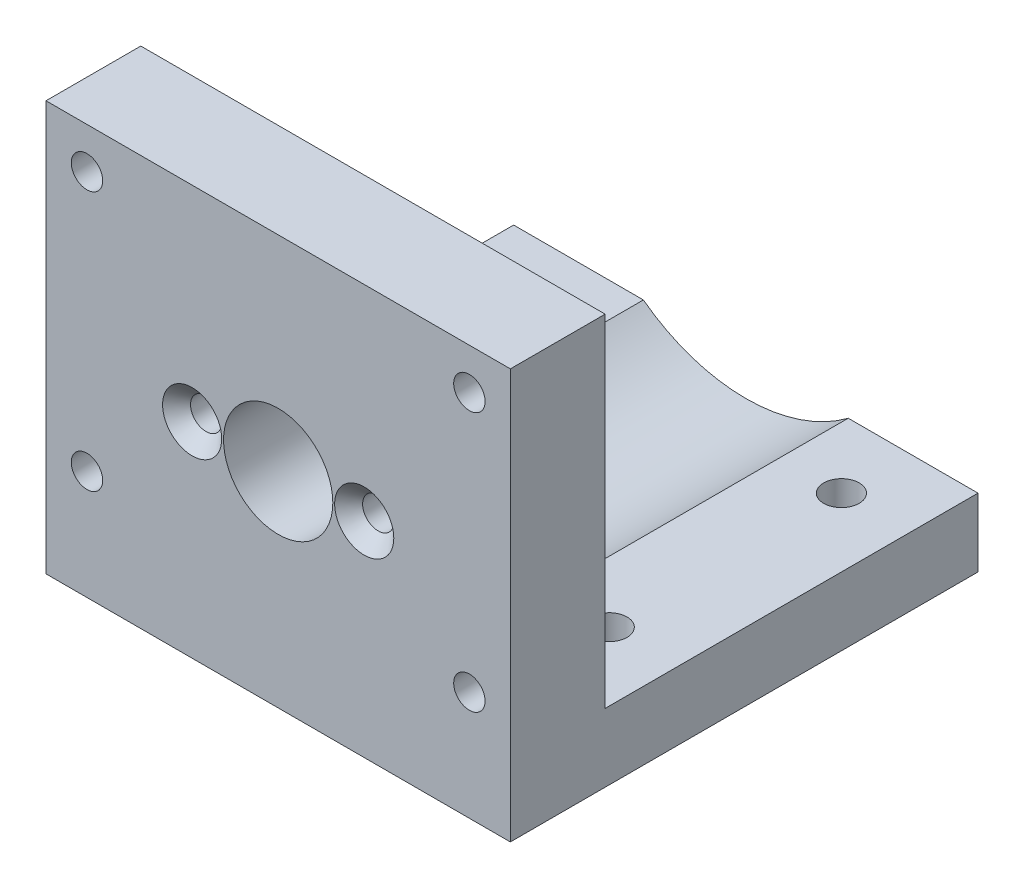
ISO-10303-21;
HEADER;
FILE_DESCRIPTION(('STEP AP214'),'2;1');
FILE_NAME('part.step','',(''),(''),'','','');
FILE_SCHEMA(('AUTOMOTIVE_DESIGN { 1 0 10303 214 1 1 1 1 }'));
ENDSEC;
DATA;
#1=APPLICATION_CONTEXT('core data for automotive mechanical design processes');
#2=APPLICATION_PROTOCOL_DEFINITION('international standard','automotive_design',2000,#1);
#3=PRODUCT_CONTEXT('',#1,'mechanical');
#4=PRODUCT('Part','Part','',(#3));
#5=PRODUCT_RELATED_PRODUCT_CATEGORY('part','',(#4));
#6=PRODUCT_DEFINITION_FORMATION('','',#4);
#7=PRODUCT_DEFINITION_CONTEXT('part definition',#1,'design');
#8=PRODUCT_DEFINITION('design','',#6,#7);
#9=PRODUCT_DEFINITION_SHAPE('','',#8);
#10=(LENGTH_UNIT() NAMED_UNIT(*) SI_UNIT(.MILLI.,.METRE.));
#11=(NAMED_UNIT(*) PLANE_ANGLE_UNIT() SI_UNIT($,.RADIAN.));
#12=(NAMED_UNIT(*) SI_UNIT($,.STERADIAN.) SOLID_ANGLE_UNIT());
#13=UNCERTAINTY_MEASURE_WITH_UNIT(LENGTH_MEASURE(1.E-05),#10,'distance_accuracy_value','');
#14=(GEOMETRIC_REPRESENTATION_CONTEXT(3) GLOBAL_UNCERTAINTY_ASSIGNED_CONTEXT((#13)) GLOBAL_UNIT_ASSIGNED_CONTEXT((#10,
#11,#12)) REPRESENTATION_CONTEXT('',''));
#15=CARTESIAN_POINT('',(0.,0.,0.));
#16=DIRECTION('',(0.,0.,1.));
#17=DIRECTION('',(1.,0.,0.));
#18=AXIS2_PLACEMENT_3D('',#15,#16,#17);
#19=CARTESIAN_POINT('',(0.,6.35,0.));
#20=DIRECTION('',(0.,-1.,0.));
#21=DIRECTION('',(0.,0.,-1.));
#22=AXIS2_PLACEMENT_3D('',#19,#20,#21);
#23=PLANE('',#22);
#24=CARTESIAN_POINT('',(36.83,6.35,-37.1348));
#25=DIRECTION('',(0.,1.,0.));
#26=DIRECTION('',(0.,0.,1.));
#27=AXIS2_PLACEMENT_3D('',#24,#25,#26);
#28=CIRCLE('',#27,1.651);
#29=CARTESIAN_POINT('',(36.83,6.35,-35.4838));
#30=VERTEX_POINT('',#29);
#31=EDGE_CURVE('E177',#30,#30,#28,.T.);
#32=ORIENTED_EDGE('',*,*,#31,.F.);
#33=EDGE_LOOP('',(#32));
#34=FACE_BOUND('',#33,.T.);
#35=CARTESIAN_POINT('',(36.83,6.35,-15.5448));
#36=DIRECTION('',(0.,1.,0.));
#37=DIRECTION('',(0.,0.,1.));
#38=AXIS2_PLACEMENT_3D('',#35,#36,#37);
#39=CIRCLE('',#38,1.651);
#40=CARTESIAN_POINT('',(36.83,6.35,-13.8938));
#41=VERTEX_POINT('',#40);
#42=EDGE_CURVE('E171',#41,#41,#39,.T.);
#43=ORIENTED_EDGE('',*,*,#42,.F.);
#44=EDGE_LOOP('',(#43));
#45=FACE_BOUND('',#44,.T.);
#46=DIRECTION('',(0.,0.,1.));
#47=VECTOR('',#46,1.);
#48=CARTESIAN_POINT('',(31.115,6.35,-43.484825));
#49=LINE('',#48,#47);
#50=CARTESIAN_POINT('',(31.115,6.35,-8.8138));
#51=VERTEX_POINT('',#50);
#52=CARTESIAN_POINT('',(31.115,6.35,-43.4848));
#53=VERTEX_POINT('',#52);
#54=EDGE_CURVE('E68',#51,#53,#49,.F.);
#55=ORIENTED_EDGE('',*,*,#54,.F.);
#56=DIRECTION('',(-1.,0.,0.));
#57=VECTOR('',#56,1.);
#58=CARTESIAN_POINT('',(0.,6.35,-8.8138));
#59=LINE('',#58,#57);
#60=CARTESIAN_POINT('',(43.18,6.35,-8.8138));
#61=VERTEX_POINT('',#60);
#62=EDGE_CURVE('E75',#61,#51,#59,.T.);
#63=ORIENTED_EDGE('',*,*,#62,.F.);
#64=DIRECTION('',(0.,0.,-1.));
#65=VECTOR('',#64,1.);
#66=CARTESIAN_POINT('',(43.18,6.35,0.));
#67=LINE('',#66,#65);
#68=CARTESIAN_POINT('',(43.18,6.35,-43.4848));
#69=VERTEX_POINT('',#68);
#70=EDGE_CURVE('E197',#61,#69,#67,.T.);
#71=ORIENTED_EDGE('',*,*,#70,.T.);
#72=DIRECTION('',(-1.,0.,0.));
#73=VECTOR('',#72,1.);
#74=CARTESIAN_POINT('',(0.,6.35,-43.4848));
#75=LINE('',#74,#73);
#76=EDGE_CURVE('E126',#69,#53,#75,.T.);
#77=ORIENTED_EDGE('',*,*,#76,.T.);
#78=EDGE_LOOP('',(#55,#63,#71,#77));
#79=FACE_BOUND('',#78,.T.);
#80=ADVANCED_FACE('F50',(#34,#45,#79),#23,.F.);
#81=CARTESIAN_POINT('',(6.35,6.35,-37.1348));
#82=DIRECTION('',(0.,1.,0.));
#83=DIRECTION('',(0.,0.,1.));
#84=AXIS2_PLACEMENT_3D('',#81,#82,#83);
#85=CIRCLE('',#84,1.651);
#86=CARTESIAN_POINT('',(6.35,6.35,-35.4838));
#87=VERTEX_POINT('',#86);
#88=EDGE_CURVE('E183',#87,#87,#85,.T.);
#89=ORIENTED_EDGE('',*,*,#88,.F.);
#90=EDGE_LOOP('',(#89));
#91=FACE_BOUND('',#90,.T.);
#92=CARTESIAN_POINT('',(6.35,6.35,-15.5448));
#93=DIRECTION('',(0.,1.,0.));
#94=DIRECTION('',(0.,0.,1.));
#95=AXIS2_PLACEMENT_3D('',#92,#93,#94);
#96=CIRCLE('',#95,1.651);
#97=CARTESIAN_POINT('',(6.35,6.35,-13.8938));
#98=VERTEX_POINT('',#97);
#99=EDGE_CURVE('E165',#98,#98,#96,.T.);
#100=ORIENTED_EDGE('',*,*,#99,.F.);
#101=EDGE_LOOP('',(#100));
#102=FACE_BOUND('',#101,.T.);
#103=DIRECTION('',(0.,0.,1.));
#104=VECTOR('',#103,1.);
#105=CARTESIAN_POINT('',(12.065,6.35,-43.484825));
#106=LINE('',#105,#104);
#107=CARTESIAN_POINT('',(12.065,6.35,-43.4848));
#108=VERTEX_POINT('',#107);
#109=CARTESIAN_POINT('',(12.065,6.35,-8.8138));
#110=VERTEX_POINT('',#109);
#111=EDGE_CURVE('E119',#108,#110,#106,.T.);
#112=ORIENTED_EDGE('',*,*,#111,.F.);
#113=CARTESIAN_POINT('',(0.,6.35,-43.4848));
#114=VERTEX_POINT('',#113);
#115=EDGE_CURVE('E200',#108,#114,#75,.T.);
#116=ORIENTED_EDGE('',*,*,#115,.T.);
#117=DIRECTION('',(0.,0.,1.));
#118=VECTOR('',#117,1.);
#119=CARTESIAN_POINT('',(0.,6.35,0.));
#120=LINE('',#119,#118);
#121=CARTESIAN_POINT('',(0.,6.35,-8.8138));
#122=VERTEX_POINT('',#121);
#123=EDGE_CURVE('E194',#114,#122,#120,.T.);
#124=ORIENTED_EDGE('',*,*,#123,.T.);
#125=EDGE_CURVE('E54',#110,#122,#59,.T.);
#126=ORIENTED_EDGE('',*,*,#125,.F.);
#127=EDGE_LOOP('',(#112,#116,#124,#126));
#128=FACE_BOUND('',#127,.T.);
#129=ADVANCED_FACE('F257',(#91,#102,#128),#23,.F.);
#130=CARTESIAN_POINT('',(0.,0.,0.));
#131=DIRECTION('',(0.,-1.,0.));
#132=DIRECTION('',(0.,0.,-1.));
#133=AXIS2_PLACEMENT_3D('',#130,#131,#132);
#134=PLANE('',#133);
#135=CARTESIAN_POINT('',(36.83,0.,-15.5448));
#136=DIRECTION('',(0.,1.,0.));
#137=DIRECTION('',(0.,0.,1.));
#138=AXIS2_PLACEMENT_3D('',#135,#136,#137);
#139=CIRCLE('',#138,1.651);
#140=CARTESIAN_POINT('',(36.83,0.,-13.8938));
#141=VERTEX_POINT('',#140);
#142=EDGE_CURVE('E168',#141,#141,#139,.T.);
#143=ORIENTED_EDGE('',*,*,#142,.T.);
#144=EDGE_LOOP('',(#143));
#145=FACE_BOUND('',#144,.T.);
#146=CARTESIAN_POINT('',(6.35,0.,-37.1348));
#147=DIRECTION('',(0.,1.,0.));
#148=DIRECTION('',(0.,0.,1.));
#149=AXIS2_PLACEMENT_3D('',#146,#147,#148);
#150=CIRCLE('',#149,1.651);
#151=CARTESIAN_POINT('',(6.35,0.,-35.4838));
#152=VERTEX_POINT('',#151);
#153=EDGE_CURVE('E180',#152,#152,#150,.T.);
#154=ORIENTED_EDGE('',*,*,#153,.T.);
#155=EDGE_LOOP('',(#154));
#156=FACE_BOUND('',#155,.T.);
#157=DIRECTION('',(0.,0.,1.));
#158=VECTOR('',#157,1.);
#159=CARTESIAN_POINT('',(0.,0.,0.));
#160=LINE('',#159,#158);
#161=CARTESIAN_POINT('',(0.,0.,-43.4848));
#162=VERTEX_POINT('',#161);
#163=CARTESIAN_POINT('',(0.,0.,0.));
#164=VERTEX_POINT('',#163);
#165=EDGE_CURVE('E186',#162,#164,#160,.T.);
#166=ORIENTED_EDGE('',*,*,#165,.F.);
#167=DIRECTION('',(-1.,0.,0.));
#168=VECTOR('',#167,1.);
#169=CARTESIAN_POINT('',(0.,0.,-43.4848));
#170=LINE('',#169,#168);
#171=CARTESIAN_POINT('',(43.18,0.,-43.4848));
#172=VERTEX_POINT('',#171);
#173=EDGE_CURVE('E198',#172,#162,#170,.T.);
#174=ORIENTED_EDGE('',*,*,#173,.F.);
#175=DIRECTION('',(0.,0.,-1.));
#176=VECTOR('',#175,1.);
#177=CARTESIAN_POINT('',(43.18,0.,0.));
#178=LINE('',#177,#176);
#179=CARTESIAN_POINT('',(43.18,0.,0.));
#180=VERTEX_POINT('',#179);
#181=EDGE_CURVE('E216',#180,#172,#178,.T.);
#182=ORIENTED_EDGE('',*,*,#181,.F.);
#183=DIRECTION('',(1.,0.,0.));
#184=VECTOR('',#183,1.);
#185=CARTESIAN_POINT('',(0.,0.,0.));
#186=LINE('',#185,#184);
#187=EDGE_CURVE('E227',#164,#180,#186,.T.);
#188=ORIENTED_EDGE('',*,*,#187,.F.);
#189=EDGE_LOOP('',(#166,#174,#182,#188));
#190=FACE_BOUND('',#189,.T.);
#191=CARTESIAN_POINT('',(36.83,0.,-37.1348));
#192=DIRECTION('',(0.,1.,0.));
#193=DIRECTION('',(0.,0.,1.));
#194=AXIS2_PLACEMENT_3D('',#191,#192,#193);
#195=CIRCLE('',#194,1.651);
#196=CARTESIAN_POINT('',(36.83,0.,-35.4838));
#197=VERTEX_POINT('',#196);
#198=EDGE_CURVE('E174',#197,#197,#195,.T.);
#199=ORIENTED_EDGE('',*,*,#198,.T.);
#200=EDGE_LOOP('',(#199));
#201=FACE_BOUND('',#200,.T.);
#202=CARTESIAN_POINT('',(6.35,0.,-15.5448));
#203=DIRECTION('',(0.,1.,0.));
#204=DIRECTION('',(0.,0.,1.));
#205=AXIS2_PLACEMENT_3D('',#202,#203,#204);
#206=CIRCLE('',#205,1.651);
#207=CARTESIAN_POINT('',(6.35,0.,-13.8938));
#208=VERTEX_POINT('',#207);
#209=EDGE_CURVE('E161',#208,#208,#206,.T.);
#210=ORIENTED_EDGE('',*,*,#209,.T.);
#211=EDGE_LOOP('',(#210));
#212=FACE_BOUND('',#211,.T.);
#213=ADVANCED_FACE('F233',(#145,#156,#190,#201,#212),#134,.T.);
#214=CARTESIAN_POINT('',(0.,6.35,0.));
#215=DIRECTION('',(1.,0.,0.));
#216=DIRECTION('',(0.,0.,-1.));
#217=AXIS2_PLACEMENT_3D('',#214,#215,#216);
#218=PLANE('',#217);
#219=ORIENTED_EDGE('',*,*,#165,.T.);
#220=DIRECTION('',(0.,-1.,0.));
#221=VECTOR('',#220,1.);
#222=CARTESIAN_POINT('',(0.,6.35,0.));
#223=LINE('',#222,#221);
#224=CARTESIAN_POINT('',(0.,38.1,0.));
#225=VERTEX_POINT('',#224);
#226=EDGE_CURVE('E13',#225,#164,#223,.T.);
#227=ORIENTED_EDGE('',*,*,#226,.F.);
#228=DIRECTION('',(0.,0.,1.));
#229=VECTOR('',#228,1.);
#230=CARTESIAN_POINT('',(0.,38.1,-8.8138));
#231=LINE('',#230,#229);
#232=CARTESIAN_POINT('',(0.,38.1,-8.8138));
#233=VERTEX_POINT('',#232);
#234=EDGE_CURVE('E158',#233,#225,#231,.T.);
#235=ORIENTED_EDGE('',*,*,#234,.F.);
#236=DIRECTION('',(0.,1.,0.));
#237=VECTOR('',#236,1.);
#238=CARTESIAN_POINT('',(0.,0.,-8.8138));
#239=LINE('',#238,#237);
#240=EDGE_CURVE('E150',#122,#233,#239,.T.);
#241=ORIENTED_EDGE('',*,*,#240,.F.);
#242=ORIENTED_EDGE('',*,*,#123,.F.);
#243=DIRECTION('',(0.,-1.,0.));
#244=VECTOR('',#243,1.);
#245=CARTESIAN_POINT('',(0.,6.35,-43.4848));
#246=LINE('',#245,#244);
#247=EDGE_CURVE('E219',#114,#162,#246,.T.);
#248=ORIENTED_EDGE('',*,*,#247,.T.);
#249=EDGE_LOOP('',(#219,#227,#235,#241,#242,#248));
#250=FACE_BOUND('',#249,.T.);
#251=ADVANCED_FACE('F52',(#250),#218,.F.);
#252=CARTESIAN_POINT('',(0.,6.35,0.));
#253=DIRECTION('',(0.,0.,-1.));
#254=DIRECTION('',(-1.,0.,0.));
#255=AXIS2_PLACEMENT_3D('',#252,#253,#254);
#256=PLANE('',#255);
#257=CARTESIAN_POINT('',(3.81,10.16,0.));
#258=DIRECTION('',(0.,0.,-1.));
#259=DIRECTION('',(-1.,0.,0.));
#260=AXIS2_PLACEMENT_3D('',#257,#258,#259);
#261=CIRCLE('',#260,1.4605);
#262=CARTESIAN_POINT('',(2.3495,10.16,0.));
#263=VERTEX_POINT('',#262);
#264=EDGE_CURVE('E476',#263,#263,#261,.T.);
#265=ORIENTED_EDGE('',*,*,#264,.T.);
#266=EDGE_LOOP('',(#265));
#267=FACE_BOUND('',#266,.T.);
#268=CARTESIAN_POINT('',(39.37,10.16,0.));
#269=DIRECTION('',(0.,0.,-1.));
#270=DIRECTION('',(-1.,0.,0.));
#271=AXIS2_PLACEMENT_3D('',#268,#269,#270);
#272=CIRCLE('',#271,1.4605);
#273=CARTESIAN_POINT('',(37.9095,10.16,0.));
#274=VERTEX_POINT('',#273);
#275=EDGE_CURVE('E483',#274,#274,#272,.T.);
#276=ORIENTED_EDGE('',*,*,#275,.T.);
#277=EDGE_LOOP('',(#276));
#278=FACE_BOUND('',#277,.T.);
#279=CARTESIAN_POINT('',(3.81,34.29,0.));
#280=DIRECTION('',(0.,0.,-1.));
#281=DIRECTION('',(-1.,0.,0.));
#282=AXIS2_PLACEMENT_3D('',#279,#280,#281);
#283=CIRCLE('',#282,1.4605);
#284=CARTESIAN_POINT('',(2.3495,34.29,0.));
#285=VERTEX_POINT('',#284);
#286=EDGE_CURVE('E489',#285,#285,#283,.T.);
#287=ORIENTED_EDGE('',*,*,#286,.T.);
#288=EDGE_LOOP('',(#287));
#289=FACE_BOUND('',#288,.T.);
#290=CARTESIAN_POINT('',(39.37,34.29,0.));
#291=DIRECTION('',(0.,0.,-1.));
#292=DIRECTION('',(-1.,0.,0.));
#293=AXIS2_PLACEMENT_3D('',#290,#291,#292);
#294=CIRCLE('',#293,1.4605);
#295=CARTESIAN_POINT('',(37.9095,34.29,0.));
#296=VERTEX_POINT('',#295);
#297=EDGE_CURVE('E495',#296,#296,#294,.T.);
#298=ORIENTED_EDGE('',*,*,#297,.T.);
#299=EDGE_LOOP('',(#298));
#300=FACE_BOUND('',#299,.T.);
#301=CARTESIAN_POINT('',(13.5900033,19.05,0.));
#302=DIRECTION('',(0.,0.,1.));
#303=DIRECTION('',(1.,0.,0.));
#304=AXIS2_PLACEMENT_3D('',#301,#302,#303);
#305=CIRCLE('',#304,2.75);
#306=CARTESIAN_POINT('',(16.3400033,19.05,0.));
#307=VERTEX_POINT('',#306);
#308=EDGE_CURVE('E498',#307,#307,#305,.T.);
#309=ORIENTED_EDGE('',*,*,#308,.F.);
#310=EDGE_LOOP('',(#309));
#311=FACE_BOUND('',#310,.T.);
#312=CARTESIAN_POINT('',(29.5899967,19.05,0.));
#313=DIRECTION('',(0.,0.,1.));
#314=DIRECTION('',(1.,0.,0.));
#315=AXIS2_PLACEMENT_3D('',#312,#313,#314);
#316=CIRCLE('',#315,2.75);
#317=CARTESIAN_POINT('',(32.3399967,19.05,0.));
#318=VERTEX_POINT('',#317);
#319=EDGE_CURVE('E507',#318,#318,#316,.T.);
#320=ORIENTED_EDGE('',*,*,#319,.F.);
#321=EDGE_LOOP('',(#320));
#322=FACE_BOUND('',#321,.T.);
#323=ORIENTED_EDGE('',*,*,#187,.T.);
#324=DIRECTION('',(0.,-1.,0.));
#325=VECTOR('',#324,1.);
#326=CARTESIAN_POINT('',(43.18,6.35,0.));
#327=LINE('',#326,#325);
#328=CARTESIAN_POINT('',(43.18,38.1,0.));
#329=VERTEX_POINT('',#328);
#330=EDGE_CURVE('E60',#329,#180,#327,.T.);
#331=ORIENTED_EDGE('',*,*,#330,.F.);
#332=DIRECTION('',(-1.,0.,0.));
#333=VECTOR('',#332,1.);
#334=CARTESIAN_POINT('',(0.,38.1,0.));
#335=LINE('',#334,#333);
#336=EDGE_CURVE('E154',#329,#225,#335,.T.);
#337=ORIENTED_EDGE('',*,*,#336,.T.);
#338=ORIENTED_EDGE('',*,*,#226,.T.);
#339=EDGE_LOOP('',(#323,#331,#337,#338));
#340=FACE_BOUND('',#339,.T.);
#341=CARTESIAN_POINT('',(21.59,19.05,0.));
#342=DIRECTION('',(0.,0.,1.));
#343=DIRECTION('',(1.,0.,0.));
#344=AXIS2_PLACEMENT_3D('',#341,#342,#343);
#345=CIRCLE('',#344,5.08);
#346=CARTESIAN_POINT('',(26.67,19.05,0.));
#347=VERTEX_POINT('',#346);
#348=EDGE_CURVE('E151',#347,#347,#345,.T.);
#349=ORIENTED_EDGE('',*,*,#348,.F.);
#350=EDGE_LOOP('',(#349));
#351=FACE_BOUND('',#350,.T.);
#352=ADVANCED_FACE('F236',(#267,#278,#289,#300,#311,#322,#340,#351),#256,.F.);
#353=CARTESIAN_POINT('',(43.18,6.35,0.));
#354=DIRECTION('',(-1.,0.,0.));
#355=DIRECTION('',(0.,0.,1.));
#356=AXIS2_PLACEMENT_3D('',#353,#354,#355);
#357=PLANE('',#356);
#358=ORIENTED_EDGE('',*,*,#181,.T.);
#359=DIRECTION('',(0.,-1.,0.));
#360=VECTOR('',#359,1.);
#361=CARTESIAN_POINT('',(43.18,6.35,-43.4848));
#362=LINE('',#361,#360);
#363=EDGE_CURVE('E215',#69,#172,#362,.T.);
#364=ORIENTED_EDGE('',*,*,#363,.F.);
#365=ORIENTED_EDGE('',*,*,#70,.F.);
#366=DIRECTION('',(0.,1.,0.));
#367=VECTOR('',#366,1.);
#368=CARTESIAN_POINT('',(43.18,0.,-8.8138));
#369=LINE('',#368,#367);
#370=CARTESIAN_POINT('',(43.18,38.1,-8.8138));
#371=VERTEX_POINT('',#370);
#372=EDGE_CURVE('E134',#61,#371,#369,.T.);
#373=ORIENTED_EDGE('',*,*,#372,.T.);
#374=DIRECTION('',(0.,0.,1.));
#375=VECTOR('',#374,1.);
#376=CARTESIAN_POINT('',(43.18,38.1,-8.8138));
#377=LINE('',#376,#375);
#378=EDGE_CURVE('E162',#371,#329,#377,.T.);
#379=ORIENTED_EDGE('',*,*,#378,.T.);
#380=ORIENTED_EDGE('',*,*,#330,.T.);
#381=EDGE_LOOP('',(#358,#364,#365,#373,#379,#380));
#382=FACE_BOUND('',#381,.T.);
#383=ADVANCED_FACE('F211',(#382),#357,.F.);
#384=CARTESIAN_POINT('',(0.,6.35,-43.4848));
#385=DIRECTION('',(0.,0.,1.));
#386=DIRECTION('',(1.,0.,0.));
#387=AXIS2_PLACEMENT_3D('',#384,#385,#386);
#388=PLANE('',#387);
#389=CARTESIAN_POINT('',(21.59,19.05,-43.4848));
#390=DIRECTION('',(0.,0.,1.));
#391=DIRECTION('',(1.,0.,0.));
#392=AXIS2_PLACEMENT_3D('',#389,#390,#391);
#393=CIRCLE('',#392,15.875);
#394=EDGE_CURVE('E122',#53,#108,#393,.F.);
#395=ORIENTED_EDGE('',*,*,#394,.F.);
#396=ORIENTED_EDGE('',*,*,#76,.F.);
#397=ORIENTED_EDGE('',*,*,#363,.T.);
#398=ORIENTED_EDGE('',*,*,#173,.T.);
#399=ORIENTED_EDGE('',*,*,#247,.F.);
#400=ORIENTED_EDGE('',*,*,#115,.F.);
#401=EDGE_LOOP('',(#395,#396,#397,#398,#399,#400));
#402=FACE_BOUND('',#401,.T.);
#403=ADVANCED_FACE('F221',(#402),#388,.F.);
#404=CARTESIAN_POINT('',(6.35,6.35,-37.1348));
#405=DIRECTION('',(0.,-1.,0.));
#406=DIRECTION('',(0.,0.,-1.));
#407=AXIS2_PLACEMENT_3D('',#404,#405,#406);
#408=CYLINDRICAL_SURFACE('',#407,1.651);
#409=ORIENTED_EDGE('',*,*,#88,.T.);
#410=EDGE_LOOP('',(#409));
#411=FACE_BOUND('',#410,.T.);
#412=ORIENTED_EDGE('',*,*,#153,.F.);
#413=EDGE_LOOP('',(#412));
#414=FACE_BOUND('',#413,.T.);
#415=ADVANCED_FACE('F268',(#411,#414),#408,.F.);
#416=CARTESIAN_POINT('',(36.83,6.35,-37.1348));
#417=DIRECTION('',(0.,-1.,0.));
#418=DIRECTION('',(0.,0.,-1.));
#419=AXIS2_PLACEMENT_3D('',#416,#417,#418);
#420=CYLINDRICAL_SURFACE('',#419,1.651);
#421=ORIENTED_EDGE('',*,*,#31,.T.);
#422=EDGE_LOOP('',(#421));
#423=FACE_BOUND('',#422,.T.);
#424=ORIENTED_EDGE('',*,*,#198,.F.);
#425=EDGE_LOOP('',(#424));
#426=FACE_BOUND('',#425,.T.);
#427=ADVANCED_FACE('F295',(#423,#426),#420,.F.);
#428=CARTESIAN_POINT('',(36.83,6.35,-15.5448));
#429=DIRECTION('',(0.,-1.,0.));
#430=DIRECTION('',(0.,0.,-1.));
#431=AXIS2_PLACEMENT_3D('',#428,#429,#430);
#432=CYLINDRICAL_SURFACE('',#431,1.651);
#433=ORIENTED_EDGE('',*,*,#42,.T.);
#434=EDGE_LOOP('',(#433));
#435=FACE_BOUND('',#434,.T.);
#436=ORIENTED_EDGE('',*,*,#142,.F.);
#437=EDGE_LOOP('',(#436));
#438=FACE_BOUND('',#437,.T.);
#439=ADVANCED_FACE('F303',(#435,#438),#432,.F.);
#440=CARTESIAN_POINT('',(6.35,6.35,-15.5448));
#441=DIRECTION('',(0.,-1.,0.));
#442=DIRECTION('',(0.,0.,-1.));
#443=AXIS2_PLACEMENT_3D('',#440,#441,#442);
#444=CYLINDRICAL_SURFACE('',#443,1.651);
#445=ORIENTED_EDGE('',*,*,#99,.T.);
#446=EDGE_LOOP('',(#445));
#447=FACE_BOUND('',#446,.T.);
#448=ORIENTED_EDGE('',*,*,#209,.F.);
#449=EDGE_LOOP('',(#448));
#450=FACE_BOUND('',#449,.T.);
#451=ADVANCED_FACE('F252',(#447,#450),#444,.F.);
#452=CARTESIAN_POINT('',(0.,38.1,-8.8138));
#453=DIRECTION('',(0.,1.,0.));
#454=DIRECTION('',(-1.,0.,0.));
#455=AXIS2_PLACEMENT_3D('',#452,#453,#454);
#456=PLANE('',#455);
#457=ORIENTED_EDGE('',*,*,#336,.F.);
#458=ORIENTED_EDGE('',*,*,#378,.F.);
#459=DIRECTION('',(-1.,0.,0.));
#460=VECTOR('',#459,1.);
#461=CARTESIAN_POINT('',(0.,38.1,-8.8138));
#462=LINE('',#461,#460);
#463=EDGE_CURVE('E136',#371,#233,#462,.T.);
#464=ORIENTED_EDGE('',*,*,#463,.T.);
#465=ORIENTED_EDGE('',*,*,#234,.T.);
#466=EDGE_LOOP('',(#457,#458,#464,#465));
#467=FACE_BOUND('',#466,.T.);
#468=ADVANCED_FACE('F208',(#467),#456,.T.);
#469=CARTESIAN_POINT('',(21.59,19.05,-8.8138));
#470=DIRECTION('',(0.,0.,1.));
#471=DIRECTION('',(1.,0.,0.));
#472=AXIS2_PLACEMENT_3D('',#469,#470,#471);
#473=CYLINDRICAL_SURFACE('',#472,5.08);
#474=CARTESIAN_POINT('',(21.59,19.05,-8.8138));
#475=DIRECTION('',(0.,0.,1.));
#476=DIRECTION('',(1.,0.,0.));
#477=AXIS2_PLACEMENT_3D('',#474,#475,#476);
#478=CIRCLE('',#477,5.08);
#479=CARTESIAN_POINT('',(26.67,19.05,-8.8138));
#480=VERTEX_POINT('',#479);
#481=EDGE_CURVE('E138',#480,#480,#478,.T.);
#482=ORIENTED_EDGE('',*,*,#481,.F.);
#483=EDGE_LOOP('',(#482));
#484=FACE_BOUND('',#483,.T.);
#485=ORIENTED_EDGE('',*,*,#348,.T.);
#486=EDGE_LOOP('',(#485));
#487=FACE_BOUND('',#486,.T.);
#488=ADVANCED_FACE('F242',(#484,#487),#473,.F.);
#489=CARTESIAN_POINT('',(0.,0.,-8.8138));
#490=DIRECTION('',(0.,0.,1.));
#491=DIRECTION('',(1.,0.,0.));
#492=AXIS2_PLACEMENT_3D('',#489,#490,#491);
#493=PLANE('',#492);
#494=ORIENTED_EDGE('',*,*,#62,.T.);
#495=CARTESIAN_POINT('',(21.59,19.05,-8.8138));
#496=DIRECTION('',(0.,0.,-1.));
#497=DIRECTION('',(-1.,0.,0.));
#498=AXIS2_PLACEMENT_3D('',#495,#496,#497);
#499=CIRCLE('',#498,15.875);
#500=EDGE_CURVE('E116',#51,#110,#499,.T.);
#501=ORIENTED_EDGE('',*,*,#500,.T.);
#502=ORIENTED_EDGE('',*,*,#125,.T.);
#503=ORIENTED_EDGE('',*,*,#240,.T.);
#504=ORIENTED_EDGE('',*,*,#463,.F.);
#505=ORIENTED_EDGE('',*,*,#372,.F.);
#506=EDGE_LOOP('',(#494,#501,#502,#503,#504,#505));
#507=FACE_BOUND('',#506,.T.);
#508=CARTESIAN_POINT('',(3.81,10.16,-8.8138));
#509=DIRECTION('',(0.,0.,-1.));
#510=DIRECTION('',(-1.,0.,0.));
#511=AXIS2_PLACEMENT_3D('',#508,#509,#510);
#512=CIRCLE('',#511,1.4605);
#513=CARTESIAN_POINT('',(2.3495,10.16,-8.8138));
#514=VERTEX_POINT('',#513);
#515=EDGE_CURVE('E127',#514,#514,#512,.T.);
#516=ORIENTED_EDGE('',*,*,#515,.F.);
#517=EDGE_LOOP('',(#516));
#518=FACE_BOUND('',#517,.T.);
#519=CARTESIAN_POINT('',(39.37,10.16,-8.8138));
#520=DIRECTION('',(0.,0.,-1.));
#521=DIRECTION('',(-1.,0.,0.));
#522=AXIS2_PLACEMENT_3D('',#519,#520,#521);
#523=CIRCLE('',#522,1.4605);
#524=CARTESIAN_POINT('',(37.9095,10.16,-8.8138));
#525=VERTEX_POINT('',#524);
#526=EDGE_CURVE('E480',#525,#525,#523,.T.);
#527=ORIENTED_EDGE('',*,*,#526,.F.);
#528=EDGE_LOOP('',(#527));
#529=FACE_BOUND('',#528,.T.);
#530=CARTESIAN_POINT('',(3.81,34.29,-8.8138));
#531=DIRECTION('',(0.,0.,-1.));
#532=DIRECTION('',(-1.,0.,0.));
#533=AXIS2_PLACEMENT_3D('',#530,#531,#532);
#534=CIRCLE('',#533,1.4605);
#535=CARTESIAN_POINT('',(2.3495,34.29,-8.8138));
#536=VERTEX_POINT('',#535);
#537=EDGE_CURVE('E486',#536,#536,#534,.T.);
#538=ORIENTED_EDGE('',*,*,#537,.F.);
#539=EDGE_LOOP('',(#538));
#540=FACE_BOUND('',#539,.T.);
#541=CARTESIAN_POINT('',(39.37,34.29,-8.8138));
#542=DIRECTION('',(0.,0.,-1.));
#543=DIRECTION('',(-1.,0.,0.));
#544=AXIS2_PLACEMENT_3D('',#541,#542,#543);
#545=CIRCLE('',#544,1.4605);
#546=CARTESIAN_POINT('',(37.9095,34.29,-8.8138));
#547=VERTEX_POINT('',#546);
#548=EDGE_CURVE('E492',#547,#547,#545,.T.);
#549=ORIENTED_EDGE('',*,*,#548,.F.);
#550=EDGE_LOOP('',(#549));
#551=FACE_BOUND('',#550,.T.);
#552=ORIENTED_EDGE('',*,*,#481,.T.);
#553=EDGE_LOOP('',(#552));
#554=FACE_BOUND('',#553,.T.);
#555=CARTESIAN_POINT('',(29.5899967,19.05,-8.8138));
#556=DIRECTION('',(0.,0.,1.));
#557=DIRECTION('',(1.,0.,0.));
#558=AXIS2_PLACEMENT_3D('',#555,#556,#557);
#559=CIRCLE('',#558,1.44999999999999);
#560=CARTESIAN_POINT('',(31.0399967,19.05,-8.8138));
#561=VERTEX_POINT('',#560);
#562=EDGE_CURVE('E155',#561,#561,#559,.T.);
#563=ORIENTED_EDGE('',*,*,#562,.T.);
#564=EDGE_LOOP('',(#563));
#565=FACE_BOUND('',#564,.T.);
#566=CARTESIAN_POINT('',(13.5900033,19.05,-8.8138));
#567=DIRECTION('',(0.,0.,1.));
#568=DIRECTION('',(1.,0.,0.));
#569=AXIS2_PLACEMENT_3D('',#566,#567,#568);
#570=CIRCLE('',#569,1.44999999999999);
#571=CARTESIAN_POINT('',(15.0400033,19.05,-8.8138));
#572=VERTEX_POINT('',#571);
#573=EDGE_CURVE('E506',#572,#572,#570,.T.);
#574=ORIENTED_EDGE('',*,*,#573,.T.);
#575=EDGE_LOOP('',(#574));
#576=FACE_BOUND('',#575,.T.);
#577=ADVANCED_FACE('F130',(#507,#518,#529,#540,#551,#554,#565,#576),#493,.F.);
#578=CARTESIAN_POINT('',(29.5899967,19.05,0.));
#579=DIRECTION('',(0.,0.,1.));
#580=DIRECTION('',(1.,0.,0.));
#581=AXIS2_PLACEMENT_3D('',#578,#579,#580);
#582=CYLINDRICAL_SURFACE('',#581,1.44999999999999);
#583=CARTESIAN_POINT('',(29.5899967,19.05,-1.30000000000001));
#584=DIRECTION('',(0.,0.,1.));
#585=DIRECTION('',(1.,0.,0.));
#586=AXIS2_PLACEMENT_3D('',#583,#584,#585);
#587=CIRCLE('',#586,1.45);
#588=CARTESIAN_POINT('',(31.0399967,19.05,-1.30000000000001));
#589=VERTEX_POINT('',#588);
#590=EDGE_CURVE('E509',#589,#589,#587,.T.);
#591=ORIENTED_EDGE('',*,*,#590,.T.);
#592=EDGE_LOOP('',(#591));
#593=FACE_BOUND('',#592,.T.);
#594=ORIENTED_EDGE('',*,*,#562,.F.);
#595=EDGE_LOOP('',(#594));
#596=FACE_BOUND('',#595,.T.);
#597=ADVANCED_FACE('F250',(#593,#596),#582,.F.);
#598=CARTESIAN_POINT('',(29.5899967,19.05,0.));
#599=DIRECTION('',(0.,0.,1.));
#600=DIRECTION('',(1.,0.,0.));
#601=AXIS2_PLACEMENT_3D('',#598,#599,#600);
#602=CONICAL_SURFACE('',#601,2.75,0.785398163397447);
#603=ORIENTED_EDGE('',*,*,#590,.F.);
#604=EDGE_LOOP('',(#603));
#605=FACE_BOUND('',#604,.T.);
#606=ORIENTED_EDGE('',*,*,#319,.T.);
#607=EDGE_LOOP('',(#606));
#608=FACE_BOUND('',#607,.T.);
#609=ADVANCED_FACE('F334',(#605,#608),#602,.F.);
#610=CARTESIAN_POINT('',(13.5900033,19.05,0.));
#611=DIRECTION('',(0.,0.,1.));
#612=DIRECTION('',(1.,0.,0.));
#613=AXIS2_PLACEMENT_3D('',#610,#611,#612);
#614=CYLINDRICAL_SURFACE('',#613,1.44999999999999);
#615=CARTESIAN_POINT('',(13.5900033,19.05,-1.30000000000001));
#616=DIRECTION('',(0.,0.,1.));
#617=DIRECTION('',(1.,0.,0.));
#618=AXIS2_PLACEMENT_3D('',#615,#616,#617);
#619=CIRCLE('',#618,1.44999999999999);
#620=CARTESIAN_POINT('',(15.0400033,19.05,-1.30000000000001));
#621=VERTEX_POINT('',#620);
#622=EDGE_CURVE('E503',#621,#621,#619,.T.);
#623=ORIENTED_EDGE('',*,*,#622,.T.);
#624=EDGE_LOOP('',(#623));
#625=FACE_BOUND('',#624,.T.);
#626=ORIENTED_EDGE('',*,*,#573,.F.);
#627=EDGE_LOOP('',(#626));
#628=FACE_BOUND('',#627,.T.);
#629=ADVANCED_FACE('F345',(#625,#628),#614,.F.);
#630=CARTESIAN_POINT('',(13.5900033,19.05,0.));
#631=DIRECTION('',(0.,0.,1.));
#632=DIRECTION('',(1.,0.,0.));
#633=AXIS2_PLACEMENT_3D('',#630,#631,#632);
#634=CONICAL_SURFACE('',#633,2.75,0.785398163397447);
#635=ORIENTED_EDGE('',*,*,#622,.F.);
#636=EDGE_LOOP('',(#635));
#637=FACE_BOUND('',#636,.T.);
#638=ORIENTED_EDGE('',*,*,#308,.T.);
#639=EDGE_LOOP('',(#638));
#640=FACE_BOUND('',#639,.T.);
#641=ADVANCED_FACE('F355',(#637,#640),#634,.F.);
#642=CARTESIAN_POINT('',(39.37,34.29,0.));
#643=DIRECTION('',(0.,0.,-1.));
#644=DIRECTION('',(-1.,0.,0.));
#645=AXIS2_PLACEMENT_3D('',#642,#643,#644);
#646=CYLINDRICAL_SURFACE('',#645,1.4605);
#647=ORIENTED_EDGE('',*,*,#297,.F.);
#648=EDGE_LOOP('',(#647));
#649=FACE_BOUND('',#648,.T.);
#650=ORIENTED_EDGE('',*,*,#548,.T.);
#651=EDGE_LOOP('',(#650));
#652=FACE_BOUND('',#651,.T.);
#653=ADVANCED_FACE('F364',(#649,#652),#646,.F.);
#654=CARTESIAN_POINT('',(3.81,34.29,0.));
#655=DIRECTION('',(0.,0.,-1.));
#656=DIRECTION('',(-1.,0.,0.));
#657=AXIS2_PLACEMENT_3D('',#654,#655,#656);
#658=CYLINDRICAL_SURFACE('',#657,1.4605);
#659=ORIENTED_EDGE('',*,*,#286,.F.);
#660=EDGE_LOOP('',(#659));
#661=FACE_BOUND('',#660,.T.);
#662=ORIENTED_EDGE('',*,*,#537,.T.);
#663=EDGE_LOOP('',(#662));
#664=FACE_BOUND('',#663,.T.);
#665=ADVANCED_FACE('F380',(#661,#664),#658,.F.);
#666=CARTESIAN_POINT('',(39.37,10.16,0.));
#667=DIRECTION('',(0.,0.,-1.));
#668=DIRECTION('',(-1.,0.,0.));
#669=AXIS2_PLACEMENT_3D('',#666,#667,#668);
#670=CYLINDRICAL_SURFACE('',#669,1.4605);
#671=ORIENTED_EDGE('',*,*,#275,.F.);
#672=EDGE_LOOP('',(#671));
#673=FACE_BOUND('',#672,.T.);
#674=ORIENTED_EDGE('',*,*,#526,.T.);
#675=EDGE_LOOP('',(#674));
#676=FACE_BOUND('',#675,.T.);
#677=ADVANCED_FACE('F390',(#673,#676),#670,.F.);
#678=CARTESIAN_POINT('',(3.81,10.16,0.));
#679=DIRECTION('',(0.,0.,-1.));
#680=DIRECTION('',(-1.,0.,0.));
#681=AXIS2_PLACEMENT_3D('',#678,#679,#680);
#682=CYLINDRICAL_SURFACE('',#681,1.4605);
#683=ORIENTED_EDGE('',*,*,#264,.F.);
#684=EDGE_LOOP('',(#683));
#685=FACE_BOUND('',#684,.T.);
#686=ORIENTED_EDGE('',*,*,#515,.T.);
#687=EDGE_LOOP('',(#686));
#688=FACE_BOUND('',#687,.T.);
#689=ADVANCED_FACE('F400',(#685,#688),#682,.F.);
#690=CARTESIAN_POINT('',(21.59,19.05,-43.484825));
#691=DIRECTION('',(0.,0.,1.));
#692=DIRECTION('',(1.,0.,0.));
#693=AXIS2_PLACEMENT_3D('',#690,#691,#692);
#694=CYLINDRICAL_SURFACE('',#693,15.875);
#695=ORIENTED_EDGE('',*,*,#54,.T.);
#696=ORIENTED_EDGE('',*,*,#394,.T.);
#697=ORIENTED_EDGE('',*,*,#111,.T.);
#698=ORIENTED_EDGE('',*,*,#500,.F.);
#699=EDGE_LOOP('',(#695,#696,#697,#698));
#700=FACE_BOUND('',#699,.T.);
#701=ADVANCED_FACE('F117',(#700),#694,.F.);
#702=CLOSED_SHELL('',(#80,#129,#213,#251,#352,#383,#403,#415,#427,#439,#451,#468,#488,#577,#597,
#609,#629,#641,#653,#665,#677,#689,#701));
#703=MANIFOLD_SOLID_BREP('B2',#702);
#704=ADVANCED_BREP_SHAPE_REPRESENTATION('',(#18,#703),#14);
#705=SHAPE_DEFINITION_REPRESENTATION(#9,#704);
ENDSEC;
END-ISO-10303-21;
